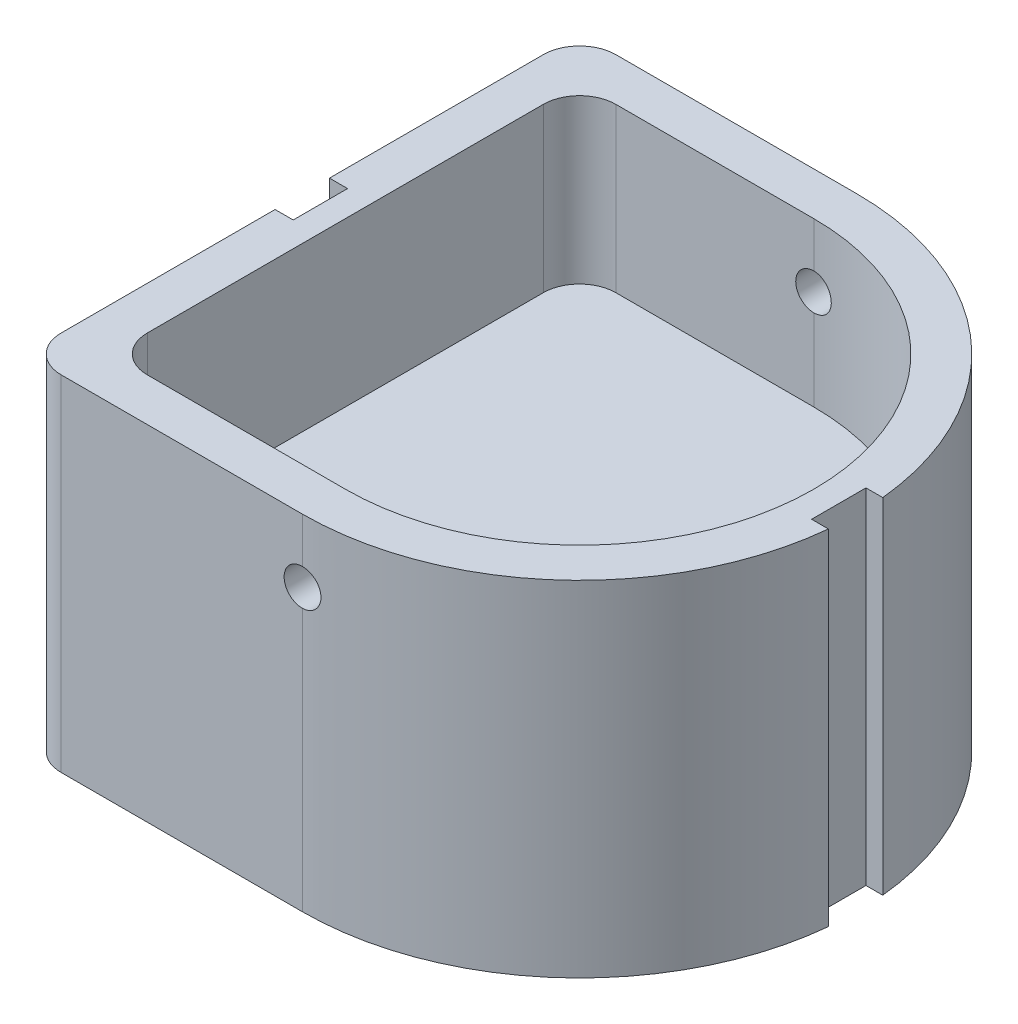
ISO-10303-21;
HEADER;
FILE_DESCRIPTION(('STEP AP214'),'2;1');
FILE_NAME('part.step','',(''),(''),'','','');
FILE_SCHEMA(('AUTOMOTIVE_DESIGN { 1 0 10303 214 1 1 1 1 }'));
ENDSEC;
DATA;
#1=APPLICATION_CONTEXT('core data for automotive mechanical design processes');
#2=APPLICATION_PROTOCOL_DEFINITION('international standard','automotive_design',2000,#1);
#3=PRODUCT_CONTEXT('',#1,'mechanical');
#4=PRODUCT('Part','Part','',(#3));
#5=PRODUCT_RELATED_PRODUCT_CATEGORY('part','',(#4));
#6=PRODUCT_DEFINITION_FORMATION('','',#4);
#7=PRODUCT_DEFINITION_CONTEXT('part definition',#1,'design');
#8=PRODUCT_DEFINITION('design','',#6,#7);
#9=PRODUCT_DEFINITION_SHAPE('','',#8);
#10=(LENGTH_UNIT() NAMED_UNIT(*) SI_UNIT(.MILLI.,.METRE.));
#11=(NAMED_UNIT(*) PLANE_ANGLE_UNIT() SI_UNIT($,.RADIAN.));
#12=(NAMED_UNIT(*) SI_UNIT($,.STERADIAN.) SOLID_ANGLE_UNIT());
#13=UNCERTAINTY_MEASURE_WITH_UNIT(LENGTH_MEASURE(1.E-05),#10,'distance_accuracy_value','');
#14=(GEOMETRIC_REPRESENTATION_CONTEXT(3) GLOBAL_UNCERTAINTY_ASSIGNED_CONTEXT((#13)) GLOBAL_UNIT_ASSIGNED_CONTEXT((#10,
#11,#12)) REPRESENTATION_CONTEXT('',''));
#15=CARTESIAN_POINT('',(0.,0.,0.));
#16=DIRECTION('',(0.,0.,1.));
#17=DIRECTION('',(1.,0.,0.));
#18=AXIS2_PLACEMENT_3D('',#15,#16,#17);
#19=CARTESIAN_POINT('',(0.,19.,0.));
#20=DIRECTION('',(0.,-1.,0.));
#21=DIRECTION('',(0.,0.,-1.));
#22=AXIS2_PLACEMENT_3D('',#19,#20,#21);
#23=CYLINDRICAL_SURFACE('',#22,15.3);
#24=DIRECTION('',(0.,-1.,0.));
#25=VECTOR('',#24,1.);
#26=CARTESIAN_POINT('',(15.2262930485394,19.,-1.5));
#27=LINE('',#26,#25);
#28=CARTESIAN_POINT('',(15.2262930485394,0.,-1.5));
#29=VERTEX_POINT('',#28);
#30=CARTESIAN_POINT('',(15.2262930485394,19.,-1.5));
#31=VERTEX_POINT('',#30);
#32=EDGE_CURVE('E201',#29,#31,#27,.F.);
#33=ORIENTED_EDGE('',*,*,#32,.F.);
#34=CARTESIAN_POINT('',(0.,0.,0.));
#35=DIRECTION('',(0.,1.,0.));
#36=DIRECTION('',(0.,0.,-1.));
#37=AXIS2_PLACEMENT_3D('',#34,#35,#36);
#38=CIRCLE('',#37,15.3);
#39=CARTESIAN_POINT('',(0.,0.,-15.3));
#40=VERTEX_POINT('',#39);
#41=EDGE_CURVE('E390',#29,#40,#38,.T.);
#42=ORIENTED_EDGE('',*,*,#41,.T.);
#43=DIRECTION('',(0.,-1.,0.));
#44=VECTOR('',#43,1.);
#45=CARTESIAN_POINT('',(0.,19.,-15.3));
#46=LINE('',#45,#44);
#47=CARTESIAN_POINT('',(0.,14.5,-15.3));
#48=VERTEX_POINT('',#47);
#49=EDGE_CURVE('E334',#48,#40,#46,.T.);
#50=ORIENTED_EDGE('',*,*,#49,.F.);
#51=CARTESIAN_POINT('',(0.,14.5,-15.3));
#52=CARTESIAN_POINT('',(0.0281021583670742,14.5000001511755,-15.3000004331714));
#53=CARTESIAN_POINT('',(0.056190824244706,14.5011853407923,-15.299922476909));
#54=CARTESIAN_POINT('',(0.112166585628104,14.5059133113102,-15.2996143787814));
#55=CARTESIAN_POINT('',(0.140053692278856,14.5094559608343,-15.2993842453967));
#56=CARTESIAN_POINT('',(0.223062277624624,14.5235856979367,-15.2984734784822));
#57=CARTESIAN_POINT('',(0.277626787633908,14.5376746714549,-15.2975724479204));
#58=CARTESIAN_POINT('',(0.383607446879149,14.5747953840197,-15.2952824253178));
#59=CARTESIAN_POINT('',(0.435022241174894,14.5978309408514,-15.2938932249842));
#60=CARTESIAN_POINT('',(0.533254512378253,14.6521861651708,-15.2907833328018));
#61=CARTESIAN_POINT('',(0.580072742016782,14.6835044731665,-15.2890626953663));
#62=CARTESIAN_POINT('',(0.667852919307626,14.7535874836872,-15.2854803357131));
#63=CARTESIAN_POINT('',(0.70880689408998,14.7923621590794,-15.2836184265874));
#64=CARTESIAN_POINT('',(0.783635713301431,14.8762419329914,-15.2799647250161));
#65=CARTESIAN_POINT('',(0.817509478705558,14.9213479946671,-15.2781729432917));
#66=CARTESIAN_POINT('',(0.877235510685562,15.0166541600984,-15.2748602846495));
#67=CARTESIAN_POINT('',(0.903080856631284,15.0668586095619,-15.2733396419363));
#68=CARTESIAN_POINT('',(0.945970870457561,15.1709027725641,-15.2707433810584));
#69=CARTESIAN_POINT('',(0.963016179042946,15.2247422211264,-15.2696677304962));
#70=CARTESIAN_POINT('',(0.987801129931908,15.3344496194499,-15.2680845087009));
#71=CARTESIAN_POINT('',(0.995553985924292,15.3903145721618,-15.2675761308881));
#72=CARTESIAN_POINT('',(1.00157479856964,15.5025564488219,-15.2671823686226));
#73=CARTESIAN_POINT('',(0.999842637353396,15.5589333791236,-15.267296991912));
#74=CARTESIAN_POINT('',(0.986953209945711,15.6705056509053,-15.2681355785337));
#75=CARTESIAN_POINT('',(0.975810529179628,15.72570268545,-15.2688585989012));
#76=CARTESIAN_POINT('',(0.944439025481191,15.8334409882378,-15.2708310139895));
#77=CARTESIAN_POINT('',(0.92421018538531,15.885982251464,-15.2720804097046));
#78=CARTESIAN_POINT('',(0.875223604343626,15.9869656498881,-15.2749658964771));
#79=CARTESIAN_POINT('',(0.846459078969083,16.0354044848322,-15.2766022949254));
#80=CARTESIAN_POINT('',(0.781223904881144,16.126769385159,-15.2800769767043));
#81=CARTESIAN_POINT('',(0.744753523586859,16.1696956417637,-15.2819152530279));
#82=CARTESIAN_POINT('',(0.665065746024241,16.2488986051923,-15.2855905271263));
#83=CARTESIAN_POINT('',(0.621836697561183,16.2851635884126,-15.2874275170843));
#84=CARTESIAN_POINT('',(0.529880753701886,16.3499348527185,-15.2908907314688));
#85=CARTESIAN_POINT('',(0.481152149991007,16.378438713549,-15.2925168900663));
#86=CARTESIAN_POINT('',(0.379566890433507,16.4268764218154,-15.29537553054));
#87=CARTESIAN_POINT('',(0.326707538452921,16.4468046157796,-15.296607752578));
#88=CARTESIAN_POINT('',(0.218423862323177,16.477469735802,-15.2985361724925));
#89=CARTESIAN_POINT('',(0.16300357452311,16.4882206383456,-15.2992331852984));
#90=CARTESIAN_POINT('',(0.089338828459952,16.4961632973265,-15.2997496759879));
#91=CARTESIAN_POINT('',(0.0714857571403937,16.4976028028236,-15.2998434958634));
#92=CARTESIAN_POINT('',(0.0357575642141534,16.4995198459381,-15.299968576698));
#93=CARTESIAN_POINT('',(0.0178825286194936,16.4999989789568,-15.299999941409));
#94=CARTESIAN_POINT('',(0.,16.5,-15.3));
#95=B_SPLINE_CURVE_WITH_KNOTS('',3,(#51,#52,#53,#54,#55,#56,#57,#58,#59,#60,#61,#62,#63,#64,#65,
#66,#67,#68,#69,#70,#71,#72,#73,#74,#75,#76,#77,#78,#79,#80,#81,#82,#83,#84,#85,#86,#87,#88,#89,
#90,#91,#92,#93,#94),.UNSPECIFIED.,.F.,.F.,(4,2,2,2,2,2,2,2,2,2,2,2,2,2,2,2,2,2,2,2,2,4),(0.,
0.0842545990631176,0.168504503166345,0.336720676348355,0.505008711609865,0.673269141986019,
0.841756205400082,1.0102689275758,1.17892650996202,1.34757181115356,1.51597701637973,
1.68438431436276,1.85253107478158,2.02067815282674,2.18895923903291,2.35723448627841,
2.52580311217739,2.69442424504445,2.86315637100516,3.03163106687056,3.08534653532916,
3.13897269574854),.UNSPECIFIED.);
#96=CARTESIAN_POINT('',(0.,16.5,-15.3));
#97=VERTEX_POINT('',#96);
#98=EDGE_CURVE('E286',#48,#97,#95,.T.);
#99=ORIENTED_EDGE('',*,*,#98,.T.);
#100=CARTESIAN_POINT('',(0.,19.,-15.3));
#101=VERTEX_POINT('',#100);
#102=EDGE_CURVE('E330',#101,#97,#46,.T.);
#103=ORIENTED_EDGE('',*,*,#102,.F.);
#104=CARTESIAN_POINT('',(0.,19.,0.));
#105=DIRECTION('',(0.,1.,0.));
#106=DIRECTION('',(0.,0.,-1.));
#107=AXIS2_PLACEMENT_3D('',#104,#105,#106);
#108=CIRCLE('',#107,15.3);
#109=EDGE_CURVE('E373',#31,#101,#108,.T.);
#110=ORIENTED_EDGE('',*,*,#109,.F.);
#111=EDGE_LOOP('',(#33,#42,#50,#99,#103,#110));
#112=FACE_BOUND('',#111,.T.);
#113=ADVANCED_FACE('F33',(#112),#23,.T.);
#114=DIRECTION('',(0.,-1.,0.));
#115=VECTOR('',#114,1.);
#116=CARTESIAN_POINT('',(15.2262930485394,19.,1.5));
#117=LINE('',#116,#115);
#118=CARTESIAN_POINT('',(15.2262930485394,19.,1.5));
#119=VERTEX_POINT('',#118);
#120=CARTESIAN_POINT('',(15.2262930485394,0.,1.5));
#121=VERTEX_POINT('',#120);
#122=EDGE_CURVE('E48',#119,#121,#117,.T.);
#123=ORIENTED_EDGE('',*,*,#122,.F.);
#124=CARTESIAN_POINT('',(0.,19.,15.3));
#125=VERTEX_POINT('',#124);
#126=EDGE_CURVE('E374',#125,#119,#108,.T.);
#127=ORIENTED_EDGE('',*,*,#126,.F.);
#128=DIRECTION('',(0.,-1.,0.));
#129=VECTOR('',#128,1.);
#130=CARTESIAN_POINT('',(0.,19.,15.3));
#131=LINE('',#130,#129);
#132=CARTESIAN_POINT('',(0.,16.5,15.3));
#133=VERTEX_POINT('',#132);
#134=EDGE_CURVE('E329',#125,#133,#131,.T.);
#135=ORIENTED_EDGE('',*,*,#134,.T.);
#136=CARTESIAN_POINT('',(0.,16.5,15.3));
#137=CARTESIAN_POINT('',(0.0281021583670762,16.4999998488245,15.3000004331714));
#138=CARTESIAN_POINT('',(0.0561908242447079,16.4988146592077,15.299922476909));
#139=CARTESIAN_POINT('',(0.112166585628106,16.4940866886899,15.2996143787814));
#140=CARTESIAN_POINT('',(0.140053692278858,16.4905440391657,15.2993842453967));
#141=CARTESIAN_POINT('',(0.223062277624626,16.4764143020633,15.2984734784822));
#142=CARTESIAN_POINT('',(0.27762678763391,16.4623253285451,15.2975724479204));
#143=CARTESIAN_POINT('',(0.383607446879151,16.4252046159803,15.2952824253178));
#144=CARTESIAN_POINT('',(0.435022241174895,16.4021690591486,15.2938932249842));
#145=CARTESIAN_POINT('',(0.533254512378254,16.3478138348292,15.2907833328018));
#146=CARTESIAN_POINT('',(0.580072742016783,16.3164955268335,15.2890626953663));
#147=CARTESIAN_POINT('',(0.667852919307626,16.2464125163128,15.2854803357131));
#148=CARTESIAN_POINT('',(0.708806894089981,16.2076378409206,15.2836184265874));
#149=CARTESIAN_POINT('',(0.783635713301432,16.1237580670086,15.2799647250161));
#150=CARTESIAN_POINT('',(0.817509478705559,16.0786520053329,15.2781729432917));
#151=CARTESIAN_POINT('',(0.877235510685564,15.9833458399016,15.2748602846495));
#152=CARTESIAN_POINT('',(0.903080856631286,15.9331413904381,15.2733396419363));
#153=CARTESIAN_POINT('',(0.945970870457562,15.8290972274359,15.2707433810584));
#154=CARTESIAN_POINT('',(0.963016179042947,15.7752577788736,15.2696677304962));
#155=CARTESIAN_POINT('',(0.987801129931908,15.6655503805501,15.2680845087009));
#156=CARTESIAN_POINT('',(0.995553985924292,15.6096854278382,15.2675761308881));
#157=CARTESIAN_POINT('',(1.00157479856964,15.4974435511781,15.2671823686226));
#158=CARTESIAN_POINT('',(0.999842637353396,15.4410666208764,15.267296991912));
#159=CARTESIAN_POINT('',(0.986953209945711,15.3294943490947,15.2681355785337));
#160=CARTESIAN_POINT('',(0.975810529179628,15.27429731455,15.2688585989012));
#161=CARTESIAN_POINT('',(0.944439025481191,15.1665590117622,15.2708310139895));
#162=CARTESIAN_POINT('',(0.92421018538531,15.114017748536,15.2720804097046));
#163=CARTESIAN_POINT('',(0.875223604343625,15.0130343501119,15.2749658964771));
#164=CARTESIAN_POINT('',(0.846459078969082,14.9645955151678,15.2766022949254));
#165=CARTESIAN_POINT('',(0.781223904881142,14.873230614841,15.2800769767043));
#166=CARTESIAN_POINT('',(0.744753523586857,14.8303043582363,15.2819152530279));
#167=CARTESIAN_POINT('',(0.66506574602424,14.7511013948077,15.2855905271263));
#168=CARTESIAN_POINT('',(0.621836697561182,14.7148364115874,15.2874275170843));
#169=CARTESIAN_POINT('',(0.529880753701886,14.6500651472815,15.2908907314688));
#170=CARTESIAN_POINT('',(0.481152149991007,14.621561286451,15.2925168900663));
#171=CARTESIAN_POINT('',(0.379566890433506,14.5731235781846,15.29537553054));
#172=CARTESIAN_POINT('',(0.32670753845292,14.5531953842204,15.296607752578));
#173=CARTESIAN_POINT('',(0.218423862323177,14.522530264198,15.2985361724925));
#174=CARTESIAN_POINT('',(0.16300357452311,14.5117793616544,15.2992331852984));
#175=CARTESIAN_POINT('',(0.089338828459952,14.5038367026735,15.2997496759879));
#176=CARTESIAN_POINT('',(0.071485757140394,14.5023971971764,15.2998434958634));
#177=CARTESIAN_POINT('',(0.0357575642141544,14.5004801540619,15.299968576698));
#178=CARTESIAN_POINT('',(0.0178825286194948,14.5000010210432,15.299999941409));
#179=CARTESIAN_POINT('',(0.,14.5,15.3));
#180=B_SPLINE_CURVE_WITH_KNOTS('',3,(#136,#137,#138,#139,#140,#141,#142,#143,#144,#145,#146,
#147,#148,#149,#150,#151,#152,#153,#154,#155,#156,#157,#158,#159,#160,#161,#162,#163,#164,#165,
#166,#167,#168,#169,#170,#171,#172,#173,#174,#175,#176,#177,#178,#179),.UNSPECIFIED.,.F.,.F.,(4,
2,2,2,2,2,2,2,2,2,2,2,2,2,2,2,2,2,2,2,2,4),(0.,0.0842545990631172,0.168504503166345,
0.336720676348354,0.505008711609864,0.673269141986017,0.841756205400081,1.0102689275758,
1.17892650996203,1.34757181115356,1.51597701637973,1.68438431436276,1.85253107478158,
2.02067815282674,2.18895923903291,2.35723448627841,2.52580311217739,2.69442424504445,
2.86315637100516,3.03163106687055,3.08534653532916,3.13897269574853),.UNSPECIFIED.);
#181=CARTESIAN_POINT('',(0.,14.5,15.3));
#182=VERTEX_POINT('',#181);
#183=EDGE_CURVE('E292',#133,#182,#180,.T.);
#184=ORIENTED_EDGE('',*,*,#183,.T.);
#185=CARTESIAN_POINT('',(0.,0.,15.3));
#186=VERTEX_POINT('',#185);
#187=EDGE_CURVE('E320',#182,#186,#131,.T.);
#188=ORIENTED_EDGE('',*,*,#187,.T.);
#189=EDGE_CURVE('E391',#186,#121,#38,.T.);
#190=ORIENTED_EDGE('',*,*,#189,.T.);
#191=EDGE_LOOP('',(#123,#127,#135,#184,#188,#190));
#192=FACE_BOUND('',#191,.T.);
#193=ADVANCED_FACE('F301',(#192),#23,.T.);
#194=CARTESIAN_POINT('',(-15.3,19.,-13.3));
#195=DIRECTION('',(1.,0.,0.));
#196=DIRECTION('',(0.,0.,-1.));
#197=AXIS2_PLACEMENT_3D('',#194,#195,#196);
#198=PLANE('',#197);
#199=DIRECTION('',(0.,-1.,0.));
#200=VECTOR('',#199,1.);
#201=CARTESIAN_POINT('',(-15.3,19.,1.5));
#202=LINE('',#201,#200);
#203=CARTESIAN_POINT('',(-15.3,19.,1.5));
#204=VERTEX_POINT('',#203);
#205=CARTESIAN_POINT('',(-15.3,0.,1.5));
#206=VERTEX_POINT('',#205);
#207=EDGE_CURVE('E223',#204,#206,#202,.T.);
#208=ORIENTED_EDGE('',*,*,#207,.T.);
#209=DIRECTION('',(0.,0.,1.));
#210=VECTOR('',#209,1.);
#211=CARTESIAN_POINT('',(-15.3,0.,-13.3));
#212=LINE('',#211,#210);
#213=CARTESIAN_POINT('',(-15.3,0.,13.3));
#214=VERTEX_POINT('',#213);
#215=EDGE_CURVE('E397',#206,#214,#212,.T.);
#216=ORIENTED_EDGE('',*,*,#215,.T.);
#217=DIRECTION('',(0.,-1.,0.));
#218=VECTOR('',#217,1.);
#219=CARTESIAN_POINT('',(-15.3,19.,13.3));
#220=LINE('',#219,#218);
#221=CARTESIAN_POINT('',(-15.3,19.,13.3));
#222=VERTEX_POINT('',#221);
#223=EDGE_CURVE('E384',#222,#214,#220,.T.);
#224=ORIENTED_EDGE('',*,*,#223,.F.);
#225=DIRECTION('',(0.,0.,1.));
#226=VECTOR('',#225,1.);
#227=CARTESIAN_POINT('',(-15.3,19.,-13.3));
#228=LINE('',#227,#226);
#229=EDGE_CURVE('E380',#204,#222,#228,.T.);
#230=ORIENTED_EDGE('',*,*,#229,.F.);
#231=EDGE_LOOP('',(#208,#216,#224,#230));
#232=FACE_BOUND('',#231,.T.);
#233=ADVANCED_FACE('F499',(#232),#198,.F.);
#234=DIRECTION('',(0.,-1.,0.));
#235=VECTOR('',#234,1.);
#236=CARTESIAN_POINT('',(-15.3,19.,-1.5));
#237=LINE('',#236,#235);
#238=CARTESIAN_POINT('',(-15.3,19.,-1.5));
#239=VERTEX_POINT('',#238);
#240=CARTESIAN_POINT('',(-15.3,0.,-1.5));
#241=VERTEX_POINT('',#240);
#242=EDGE_CURVE('E56',#239,#241,#237,.T.);
#243=ORIENTED_EDGE('',*,*,#242,.F.);
#244=CARTESIAN_POINT('',(-15.3,19.,-13.3));
#245=VERTEX_POINT('',#244);
#246=EDGE_CURVE('E381',#245,#239,#228,.T.);
#247=ORIENTED_EDGE('',*,*,#246,.F.);
#248=DIRECTION('',(0.,-1.,0.));
#249=VECTOR('',#248,1.);
#250=CARTESIAN_POINT('',(-15.3,19.,-13.3));
#251=LINE('',#250,#249);
#252=CARTESIAN_POINT('',(-15.3,0.,-13.3));
#253=VERTEX_POINT('',#252);
#254=EDGE_CURVE('E402',#245,#253,#251,.T.);
#255=ORIENTED_EDGE('',*,*,#254,.T.);
#256=EDGE_CURVE('E371',#253,#241,#212,.T.);
#257=ORIENTED_EDGE('',*,*,#256,.T.);
#258=EDGE_LOOP('',(#243,#247,#255,#257));
#259=FACE_BOUND('',#258,.T.);
#260=ADVANCED_FACE('F419',(#259),#198,.F.);
#261=CARTESIAN_POINT('',(-13.3,19.,13.3));
#262=DIRECTION('',(0.,-1.,0.));
#263=DIRECTION('',(0.,0.,-1.));
#264=AXIS2_PLACEMENT_3D('',#261,#262,#263);
#265=PLANE('',#264);
#266=DIRECTION('',(0.,0.,1.));
#267=VECTOR('',#266,1.);
#268=CARTESIAN_POINT('',(-12.925,19.,-10.925));
#269=LINE('',#268,#267);
#270=CARTESIAN_POINT('',(-12.925,19.,-10.925));
#271=VERTEX_POINT('',#270);
#272=CARTESIAN_POINT('',(-12.925,19.,10.925));
#273=VERTEX_POINT('',#272);
#274=EDGE_CURVE('E467',#271,#273,#269,.T.);
#275=ORIENTED_EDGE('',*,*,#274,.F.);
#276=CARTESIAN_POINT('',(-10.925,19.,-10.925));
#277=DIRECTION('',(0.,1.,0.));
#278=DIRECTION('',(0.,0.,-1.));
#279=AXIS2_PLACEMENT_3D('',#276,#277,#278);
#280=CIRCLE('',#279,2.);
#281=CARTESIAN_POINT('',(-10.925,19.,-12.925));
#282=VERTEX_POINT('',#281);
#283=EDGE_CURVE('E450',#282,#271,#280,.T.);
#284=ORIENTED_EDGE('',*,*,#283,.F.);
#285=DIRECTION('',(-1.,0.,0.));
#286=VECTOR('',#285,1.);
#287=CARTESIAN_POINT('',(-10.925,19.,-12.925));
#288=LINE('',#287,#286);
#289=CARTESIAN_POINT('',(0.,19.,-12.925));
#290=VERTEX_POINT('',#289);
#291=EDGE_CURVE('E445',#290,#282,#288,.T.);
#292=ORIENTED_EDGE('',*,*,#291,.F.);
#293=CARTESIAN_POINT('',(0.,19.,0.));
#294=DIRECTION('',(0.,1.,0.));
#295=DIRECTION('',(0.,0.,-1.));
#296=AXIS2_PLACEMENT_3D('',#293,#294,#295);
#297=CIRCLE('',#296,12.925);
#298=CARTESIAN_POINT('',(0.,19.,12.925));
#299=VERTEX_POINT('',#298);
#300=EDGE_CURVE('E441',#299,#290,#297,.T.);
#301=ORIENTED_EDGE('',*,*,#300,.F.);
#302=DIRECTION('',(1.,0.,0.));
#303=VECTOR('',#302,1.);
#304=CARTESIAN_POINT('',(-10.925,19.,12.925));
#305=LINE('',#304,#303);
#306=CARTESIAN_POINT('',(-10.925,19.,12.925));
#307=VERTEX_POINT('',#306);
#308=EDGE_CURVE('E446',#307,#299,#305,.T.);
#309=ORIENTED_EDGE('',*,*,#308,.F.);
#310=CARTESIAN_POINT('',(-10.925,19.,10.925));
#311=DIRECTION('',(0.,1.,0.));
#312=DIRECTION('',(0.,0.,-1.));
#313=AXIS2_PLACEMENT_3D('',#310,#311,#312);
#314=CIRCLE('',#313,2.);
#315=EDGE_CURVE('E470',#273,#307,#314,.T.);
#316=ORIENTED_EDGE('',*,*,#315,.F.);
#317=EDGE_LOOP('',(#275,#284,#292,#301,#309,#316));
#318=FACE_BOUND('',#317,.T.);
#319=DIRECTION('',(-1.,0.,0.));
#320=VECTOR('',#319,1.);
#321=CARTESIAN_POINT('',(14.3,19.,-1.5));
#322=LINE('',#321,#320);
#323=CARTESIAN_POINT('',(14.3,19.,-1.5));
#324=VERTEX_POINT('',#323);
#325=EDGE_CURVE('E195',#31,#324,#322,.T.);
#326=ORIENTED_EDGE('',*,*,#325,.F.);
#327=ORIENTED_EDGE('',*,*,#109,.T.);
#328=DIRECTION('',(-1.,0.,0.));
#329=VECTOR('',#328,1.);
#330=CARTESIAN_POINT('',(-13.3,19.,-15.3));
#331=LINE('',#330,#329);
#332=CARTESIAN_POINT('',(-13.3,19.,-15.3));
#333=VERTEX_POINT('',#332);
#334=EDGE_CURVE('E376',#101,#333,#331,.T.);
#335=ORIENTED_EDGE('',*,*,#334,.T.);
#336=CARTESIAN_POINT('',(-13.3,19.,-13.3));
#337=DIRECTION('',(0.,1.,0.));
#338=DIRECTION('',(0.,0.,-1.));
#339=AXIS2_PLACEMENT_3D('',#336,#337,#338);
#340=CIRCLE('',#339,2.);
#341=EDGE_CURVE('E378',#333,#245,#340,.T.);
#342=ORIENTED_EDGE('',*,*,#341,.T.);
#343=ORIENTED_EDGE('',*,*,#246,.T.);
#344=DIRECTION('',(-1.,0.,0.));
#345=VECTOR('',#344,1.);
#346=CARTESIAN_POINT('',(-14.3,19.,-1.5));
#347=LINE('',#346,#345);
#348=CARTESIAN_POINT('',(-14.3,19.,-1.5));
#349=VERTEX_POINT('',#348);
#350=EDGE_CURVE('E231',#349,#239,#347,.T.);
#351=ORIENTED_EDGE('',*,*,#350,.F.);
#352=DIRECTION('',(0.,0.,-1.));
#353=VECTOR('',#352,1.);
#354=CARTESIAN_POINT('',(-14.3,19.,1.5));
#355=LINE('',#354,#353);
#356=CARTESIAN_POINT('',(-14.3,19.,1.5));
#357=VERTEX_POINT('',#356);
#358=EDGE_CURVE('E228',#357,#349,#355,.T.);
#359=ORIENTED_EDGE('',*,*,#358,.F.);
#360=DIRECTION('',(1.,0.,0.));
#361=VECTOR('',#360,1.);
#362=CARTESIAN_POINT('',(-14.3,19.,1.5));
#363=LINE('',#362,#361);
#364=EDGE_CURVE('E226',#204,#357,#363,.T.);
#365=ORIENTED_EDGE('',*,*,#364,.F.);
#366=ORIENTED_EDGE('',*,*,#229,.T.);
#367=CARTESIAN_POINT('',(-13.3,19.,13.3));
#368=DIRECTION('',(0.,1.,0.));
#369=DIRECTION('',(0.,0.,-1.));
#370=AXIS2_PLACEMENT_3D('',#367,#368,#369);
#371=CIRCLE('',#370,2.);
#372=CARTESIAN_POINT('',(-13.3,19.,15.3));
#373=VERTEX_POINT('',#372);
#374=EDGE_CURVE('E367',#222,#373,#371,.T.);
#375=ORIENTED_EDGE('',*,*,#374,.T.);
#376=DIRECTION('',(1.,0.,0.));
#377=VECTOR('',#376,1.);
#378=CARTESIAN_POINT('',(-13.3,19.,15.3));
#379=LINE('',#378,#377);
#380=EDGE_CURVE('E370',#373,#125,#379,.T.);
#381=ORIENTED_EDGE('',*,*,#380,.T.);
#382=ORIENTED_EDGE('',*,*,#126,.T.);
#383=DIRECTION('',(1.,0.,0.));
#384=VECTOR('',#383,1.);
#385=CARTESIAN_POINT('',(14.3,19.,1.5));
#386=LINE('',#385,#384);
#387=CARTESIAN_POINT('',(14.3,19.,1.5));
#388=VERTEX_POINT('',#387);
#389=EDGE_CURVE('E218',#388,#119,#386,.T.);
#390=ORIENTED_EDGE('',*,*,#389,.F.);
#391=DIRECTION('',(0.,0.,1.));
#392=VECTOR('',#391,1.);
#393=CARTESIAN_POINT('',(14.3,19.,1.5));
#394=LINE('',#393,#392);
#395=EDGE_CURVE('E205',#324,#388,#394,.T.);
#396=ORIENTED_EDGE('',*,*,#395,.F.);
#397=EDGE_LOOP('',(#326,#327,#335,#342,#343,#351,#359,#365,#366,#375,#381,#382,#390,#396));
#398=FACE_BOUND('',#397,.T.);
#399=ADVANCED_FACE('F216',(#318,#398),#265,.F.);
#400=CARTESIAN_POINT('',(-13.3,0.,13.3));
#401=DIRECTION('',(0.,-1.,0.));
#402=DIRECTION('',(0.,0.,-1.));
#403=AXIS2_PLACEMENT_3D('',#400,#401,#402);
#404=PLANE('',#403);
#405=ORIENTED_EDGE('',*,*,#41,.F.);
#406=DIRECTION('',(-1.,0.,0.));
#407=VECTOR('',#406,1.);
#408=CARTESIAN_POINT('',(-13.3,0.,-1.5));
#409=LINE('',#408,#407);
#410=CARTESIAN_POINT('',(14.3,0.,-1.5));
#411=VERTEX_POINT('',#410);
#412=EDGE_CURVE('E11',#29,#411,#409,.T.);
#413=ORIENTED_EDGE('',*,*,#412,.T.);
#414=DIRECTION('',(0.,0.,1.));
#415=VECTOR('',#414,1.);
#416=CARTESIAN_POINT('',(14.3,0.,1.5));
#417=LINE('',#416,#415);
#418=CARTESIAN_POINT('',(14.3,0.,1.5));
#419=VERTEX_POINT('',#418);
#420=EDGE_CURVE('E212',#411,#419,#417,.T.);
#421=ORIENTED_EDGE('',*,*,#420,.T.);
#422=DIRECTION('',(1.,0.,0.));
#423=VECTOR('',#422,1.);
#424=CARTESIAN_POINT('',(14.3,0.,1.5));
#425=LINE('',#424,#423);
#426=EDGE_CURVE('E206',#419,#121,#425,.T.);
#427=ORIENTED_EDGE('',*,*,#426,.T.);
#428=ORIENTED_EDGE('',*,*,#189,.F.);
#429=DIRECTION('',(1.,0.,0.));
#430=VECTOR('',#429,1.);
#431=CARTESIAN_POINT('',(-13.3,0.,15.3));
#432=LINE('',#431,#430);
#433=CARTESIAN_POINT('',(-13.3,0.,15.3));
#434=VERTEX_POINT('',#433);
#435=EDGE_CURVE('E324',#434,#186,#432,.T.);
#436=ORIENTED_EDGE('',*,*,#435,.F.);
#437=CARTESIAN_POINT('',(-13.3,0.,13.3));
#438=DIRECTION('',(0.,1.,0.));
#439=DIRECTION('',(0.,0.,-1.));
#440=AXIS2_PLACEMENT_3D('',#437,#438,#439);
#441=CIRCLE('',#440,2.);
#442=EDGE_CURVE('E385',#214,#434,#441,.T.);
#443=ORIENTED_EDGE('',*,*,#442,.F.);
#444=ORIENTED_EDGE('',*,*,#215,.F.);
#445=DIRECTION('',(1.,0.,0.));
#446=VECTOR('',#445,1.);
#447=CARTESIAN_POINT('',(-14.3,0.,1.5));
#448=LINE('',#447,#446);
#449=CARTESIAN_POINT('',(-14.3,0.,1.5));
#450=VERTEX_POINT('',#449);
#451=EDGE_CURVE('E233',#206,#450,#448,.T.);
#452=ORIENTED_EDGE('',*,*,#451,.T.);
#453=DIRECTION('',(0.,0.,-1.));
#454=VECTOR('',#453,1.);
#455=CARTESIAN_POINT('',(-14.3,0.,1.5));
#456=LINE('',#455,#454);
#457=CARTESIAN_POINT('',(-14.3,0.,-1.5));
#458=VERTEX_POINT('',#457);
#459=EDGE_CURVE('E236',#450,#458,#456,.T.);
#460=ORIENTED_EDGE('',*,*,#459,.T.);
#461=DIRECTION('',(-1.,0.,0.));
#462=VECTOR('',#461,1.);
#463=CARTESIAN_POINT('',(-14.3,0.,-1.5));
#464=LINE('',#463,#462);
#465=EDGE_CURVE('E229',#458,#241,#464,.T.);
#466=ORIENTED_EDGE('',*,*,#465,.T.);
#467=ORIENTED_EDGE('',*,*,#256,.F.);
#468=CARTESIAN_POINT('',(-13.3,0.,-13.3));
#469=DIRECTION('',(0.,1.,0.));
#470=DIRECTION('',(0.,0.,-1.));
#471=AXIS2_PLACEMENT_3D('',#468,#469,#470);
#472=CIRCLE('',#471,2.);
#473=CARTESIAN_POINT('',(-13.3,0.,-15.3));
#474=VERTEX_POINT('',#473);
#475=EDGE_CURVE('E395',#474,#253,#472,.T.);
#476=ORIENTED_EDGE('',*,*,#475,.F.);
#477=DIRECTION('',(-1.,0.,0.));
#478=VECTOR('',#477,1.);
#479=CARTESIAN_POINT('',(-13.3,0.,-15.3));
#480=LINE('',#479,#478);
#481=EDGE_CURVE('E393',#40,#474,#480,.T.);
#482=ORIENTED_EDGE('',*,*,#481,.F.);
#483=EDGE_LOOP('',(#405,#413,#421,#427,#428,#436,#443,#444,#452,#460,#466,#467,#476,#482));
#484=FACE_BOUND('',#483,.T.);
#485=ADVANCED_FACE('F315',(#484),#404,.T.);
#486=CARTESIAN_POINT('',(-13.3,19.,13.3));
#487=DIRECTION('',(0.,-1.,0.));
#488=DIRECTION('',(0.,0.,-1.));
#489=AXIS2_PLACEMENT_3D('',#486,#487,#488);
#490=CYLINDRICAL_SURFACE('',#489,2.);
#491=ORIENTED_EDGE('',*,*,#442,.T.);
#492=DIRECTION('',(0.,-1.,0.));
#493=VECTOR('',#492,1.);
#494=CARTESIAN_POINT('',(-13.3,19.,15.3));
#495=LINE('',#494,#493);
#496=EDGE_CURVE('E332',#373,#434,#495,.T.);
#497=ORIENTED_EDGE('',*,*,#496,.F.);
#498=ORIENTED_EDGE('',*,*,#374,.F.);
#499=ORIENTED_EDGE('',*,*,#223,.T.);
#500=EDGE_LOOP('',(#491,#497,#498,#499));
#501=FACE_BOUND('',#500,.T.);
#502=ADVANCED_FACE('F35',(#501),#490,.T.);
#503=CARTESIAN_POINT('',(-13.3,19.,15.3));
#504=DIRECTION('',(0.,0.,-1.));
#505=DIRECTION('',(-1.,0.,0.));
#506=AXIS2_PLACEMENT_3D('',#503,#504,#505);
#507=PLANE('',#506);
#508=ORIENTED_EDGE('',*,*,#187,.F.);
#509=CARTESIAN_POINT('',(0.,15.5,15.3));
#510=DIRECTION('',(0.,0.,1.));
#511=DIRECTION('',(1.,0.,0.));
#512=AXIS2_PLACEMENT_3D('',#509,#510,#511);
#513=CIRCLE('',#512,1.);
#514=EDGE_CURVE('E249',#133,#182,#513,.T.);
#515=ORIENTED_EDGE('',*,*,#514,.F.);
#516=ORIENTED_EDGE('',*,*,#134,.F.);
#517=ORIENTED_EDGE('',*,*,#380,.F.);
#518=ORIENTED_EDGE('',*,*,#496,.T.);
#519=ORIENTED_EDGE('',*,*,#435,.T.);
#520=EDGE_LOOP('',(#508,#515,#516,#517,#518,#519));
#521=FACE_BOUND('',#520,.T.);
#522=ADVANCED_FACE('F305',(#521),#507,.F.);
#523=CARTESIAN_POINT('',(-13.3,19.,-15.3));
#524=DIRECTION('',(0.,0.,1.));
#525=DIRECTION('',(1.,0.,0.));
#526=AXIS2_PLACEMENT_3D('',#523,#524,#525);
#527=PLANE('',#526);
#528=ORIENTED_EDGE('',*,*,#102,.T.);
#529=CARTESIAN_POINT('',(0.,15.5,-15.3));
#530=DIRECTION('',(0.,0.,1.));
#531=DIRECTION('',(1.,0.,0.));
#532=AXIS2_PLACEMENT_3D('',#529,#530,#531);
#533=CIRCLE('',#532,1.);
#534=EDGE_CURVE('E251',#97,#48,#533,.T.);
#535=ORIENTED_EDGE('',*,*,#534,.T.);
#536=ORIENTED_EDGE('',*,*,#49,.T.);
#537=ORIENTED_EDGE('',*,*,#481,.T.);
#538=DIRECTION('',(0.,-1.,0.));
#539=VECTOR('',#538,1.);
#540=CARTESIAN_POINT('',(-13.3,19.,-15.3));
#541=LINE('',#540,#539);
#542=EDGE_CURVE('E404',#333,#474,#541,.T.);
#543=ORIENTED_EDGE('',*,*,#542,.F.);
#544=ORIENTED_EDGE('',*,*,#334,.F.);
#545=EDGE_LOOP('',(#528,#535,#536,#537,#543,#544));
#546=FACE_BOUND('',#545,.T.);
#547=ADVANCED_FACE('F303',(#546),#527,.F.);
#548=CARTESIAN_POINT('',(-13.3,19.,-13.3));
#549=DIRECTION('',(0.,-1.,0.));
#550=DIRECTION('',(0.,0.,-1.));
#551=AXIS2_PLACEMENT_3D('',#548,#549,#550);
#552=CYLINDRICAL_SURFACE('',#551,2.);
#553=ORIENTED_EDGE('',*,*,#475,.T.);
#554=ORIENTED_EDGE('',*,*,#254,.F.);
#555=ORIENTED_EDGE('',*,*,#341,.F.);
#556=ORIENTED_EDGE('',*,*,#542,.T.);
#557=EDGE_LOOP('',(#553,#554,#555,#556));
#558=FACE_BOUND('',#557,.T.);
#559=ADVANCED_FACE('F313',(#558),#552,.T.);
#560=CARTESIAN_POINT('',(-10.925,10.,-10.925));
#561=DIRECTION('',(0.,1.,0.));
#562=DIRECTION('',(0.,0.,1.));
#563=AXIS2_PLACEMENT_3D('',#560,#561,#562);
#564=CYLINDRICAL_SURFACE('',#563,2.);
#565=ORIENTED_EDGE('',*,*,#283,.T.);
#566=DIRECTION('',(0.,1.,0.));
#567=VECTOR('',#566,1.);
#568=CARTESIAN_POINT('',(-12.925,10.,-10.925));
#569=LINE('',#568,#567);
#570=CARTESIAN_POINT('',(-12.925,10.,-10.925));
#571=VERTEX_POINT('',#570);
#572=EDGE_CURVE('E363',#571,#271,#569,.T.);
#573=ORIENTED_EDGE('',*,*,#572,.F.);
#574=CARTESIAN_POINT('',(-10.925,10.,-10.925));
#575=DIRECTION('',(0.,1.,0.));
#576=DIRECTION('',(0.,0.,-1.));
#577=AXIS2_PLACEMENT_3D('',#574,#575,#576);
#578=CIRCLE('',#577,2.);
#579=CARTESIAN_POINT('',(-10.925,10.,-12.925));
#580=VERTEX_POINT('',#579);
#581=EDGE_CURVE('E451',#580,#571,#578,.T.);
#582=ORIENTED_EDGE('',*,*,#581,.F.);
#583=DIRECTION('',(0.,1.,0.));
#584=VECTOR('',#583,1.);
#585=CARTESIAN_POINT('',(-10.925,10.,-12.925));
#586=LINE('',#585,#584);
#587=EDGE_CURVE('E388',#580,#282,#586,.T.);
#588=ORIENTED_EDGE('',*,*,#587,.T.);
#589=EDGE_LOOP('',(#565,#573,#582,#588));
#590=FACE_BOUND('',#589,.T.);
#591=ADVANCED_FACE('F458',(#590),#564,.F.);
#592=CARTESIAN_POINT('',(-10.925,10.,-12.925));
#593=DIRECTION('',(0.,0.,-1.));
#594=DIRECTION('',(-1.,0.,0.));
#595=AXIS2_PLACEMENT_3D('',#592,#593,#594);
#596=PLANE('',#595);
#597=DIRECTION('',(0.,1.,0.));
#598=VECTOR('',#597,1.);
#599=CARTESIAN_POINT('',(0.,10.,-12.925));
#600=LINE('',#599,#598);
#601=CARTESIAN_POINT('',(0.,10.,-12.925));
#602=VERTEX_POINT('',#601);
#603=CARTESIAN_POINT('',(0.,14.5,-12.925));
#604=VERTEX_POINT('',#603);
#605=EDGE_CURVE('E355',#602,#604,#600,.T.);
#606=ORIENTED_EDGE('',*,*,#605,.T.);
#607=CARTESIAN_POINT('',(0.,15.5,-12.925));
#608=DIRECTION('',(0.,0.,-1.));
#609=DIRECTION('',(-1.,0.,0.));
#610=AXIS2_PLACEMENT_3D('',#607,#608,#609);
#611=CIRCLE('',#610,1.);
#612=CARTESIAN_POINT('',(0.,16.5,-12.925));
#613=VERTEX_POINT('',#612);
#614=EDGE_CURVE('E293',#604,#613,#611,.T.);
#615=ORIENTED_EDGE('',*,*,#614,.T.);
#616=EDGE_CURVE('E353',#613,#290,#600,.T.);
#617=ORIENTED_EDGE('',*,*,#616,.T.);
#618=ORIENTED_EDGE('',*,*,#291,.T.);
#619=ORIENTED_EDGE('',*,*,#587,.F.);
#620=DIRECTION('',(-1.,0.,0.));
#621=VECTOR('',#620,1.);
#622=CARTESIAN_POINT('',(-10.925,10.,-12.925));
#623=LINE('',#622,#621);
#624=EDGE_CURVE('E366',#602,#580,#623,.T.);
#625=ORIENTED_EDGE('',*,*,#624,.F.);
#626=EDGE_LOOP('',(#606,#615,#617,#618,#619,#625));
#627=FACE_BOUND('',#626,.T.);
#628=ADVANCED_FACE('F436',(#627),#596,.F.);
#629=CARTESIAN_POINT('',(0.,10.,0.));
#630=DIRECTION('',(0.,1.,0.));
#631=DIRECTION('',(0.,0.,1.));
#632=AXIS2_PLACEMENT_3D('',#629,#630,#631);
#633=CYLINDRICAL_SURFACE('',#632,12.925);
#634=ORIENTED_EDGE('',*,*,#616,.F.);
#635=CARTESIAN_POINT('',(0.,16.5,-12.925));
#636=CARTESIAN_POINT('',(0.0280894031159087,16.4999998630191,-12.9250005120285));
#637=CARTESIAN_POINT('',(0.0561653083717261,16.4988157346151,-12.9249083152756));
#638=CARTESIAN_POINT('',(0.112115406460813,16.4940920908807,-12.9245439342643));
#639=CARTESIAN_POINT('',(0.139989611067656,16.4905527141692,-12.9242717605986));
#640=CARTESIAN_POINT('',(0.222957473395579,16.4764365781678,-12.9231946365988));
#641=CARTESIAN_POINT('',(0.27749406917318,16.4623617126513,-12.9221290467211));
#642=CARTESIAN_POINT('',(0.383419253033411,16.4252806223129,-12.919420705338));
#643=CARTESIAN_POINT('',(0.434806533358664,16.4022707159113,-12.9177777159482));
#644=CARTESIAN_POINT('',(0.532989377393052,16.3479781451804,-12.9140993178811));
#645=CARTESIAN_POINT('',(0.579785634111542,16.3166967320671,-12.9120639685679));
#646=CARTESIAN_POINT('',(0.667554868155711,16.2466783620702,-12.9078245225699));
#647=CARTESIAN_POINT('',(0.7085167588572,16.2079275317866,-12.9056201165463));
#648=CARTESIAN_POINT('',(0.783367322813223,16.1240941973409,-12.9012933348561));
#649=CARTESIAN_POINT('',(0.817254917251253,16.079010729215,-12.8991709717409));
#650=CARTESIAN_POINT('',(0.877026068488666,15.9837272187638,-12.8952453223217));
#651=CARTESIAN_POINT('',(0.902899752300504,15.9335209656485,-12.8934424307608));
#652=CARTESIAN_POINT('',(0.945844288843977,15.8294636150396,-12.8903634457079));
#653=CARTESIAN_POINT('',(0.962915814104704,15.7756127963649,-12.8890873119703));
#654=CARTESIAN_POINT('',(0.987740700768419,15.6659063693094,-12.8872087593228));
#655=CARTESIAN_POINT('',(0.995512633777033,15.6100549867667,-12.8866049978301));
#656=CARTESIAN_POINT('',(1.00157512809244,15.4978360294966,-12.8861352615387));
#657=CARTESIAN_POINT('',(0.999865611961393,15.4414684505569,-12.8862692927657));
#658=CARTESIAN_POINT('',(0.987028765282312,15.329947324022,-12.8872588075584));
#659=CARTESIAN_POINT('',(0.97592186793124,15.274791408592,-12.8881127258231));
#660=CARTESIAN_POINT('',(0.944637309725585,15.1671293451367,-12.8904433324407));
#661=CARTESIAN_POINT('',(0.924459613595334,15.1146232074172,-12.8919200232155));
#662=CARTESIAN_POINT('',(0.875582805761294,15.0136845920347,-12.8953316194601));
#663=CARTESIAN_POINT('',(0.846874319861488,14.9652566713121,-12.8972670285238));
#664=CARTESIAN_POINT('',(0.781758946561462,14.8739015291719,-12.9013773871913));
#665=CARTESIAN_POINT('',(0.74535228155488,14.8309741489062,-12.9035523298744));
#666=CARTESIAN_POINT('',(0.66576516409626,14.7517229281415,-12.9079034126288));
#667=CARTESIAN_POINT('',(0.622568004441429,14.7154158650733,-12.9100795420998));
#668=CARTESIAN_POINT('',(0.530665862330827,14.6505548670553,-12.9141833059641));
#669=CARTESIAN_POINT('',(0.481959182053487,14.6220033313297,-12.9161108633633));
#670=CARTESIAN_POINT('',(0.380403641270504,14.5734661575148,-12.9195008066197));
#671=CARTESIAN_POINT('',(0.327551962542304,14.5534864082401,-12.9209628725071));
#672=CARTESIAN_POINT('',(0.219270497788505,14.5227191065877,-12.9232528292096));
#673=CARTESIAN_POINT('',(0.163844760875134,14.5119176006251,-12.9240816824967));
#674=CARTESIAN_POINT('',(0.090032423508655,14.5038966207766,-12.9246990558738));
#675=CARTESIAN_POINT('',(0.0720412605108023,14.5024346423821,-12.9248118458341));
#676=CARTESIAN_POINT('',(0.0360358699709693,14.5004876580531,-12.9249622216494));
#677=CARTESIAN_POINT('',(0.0180217307942248,14.5000010284907,-12.9249999324851));
#678=CARTESIAN_POINT('',(0.,14.5,-12.925));
#679=B_SPLINE_CURVE_WITH_KNOTS('',3,(#635,#636,#637,#638,#639,#640,#641,#642,#643,#644,#645,
#646,#647,#648,#649,#650,#651,#652,#653,#654,#655,#656,#657,#658,#659,#660,#661,#662,#663,#664,
#665,#666,#667,#668,#669,#670,#671,#672,#673,#674,#675,#676,#677,#678),.UNSPECIFIED.,.F.,.F.,(4,
2,2,2,2,2,2,2,2,2,2,2,2,2,2,2,2,2,2,2,2,4),(0.,0.0842163197514775,0.168427683358986,
0.336561080710307,0.504763829110333,0.672941148320622,0.841433896928736,1.00995232161532,
1.17867753955103,1.34738986412221,1.51576469903871,1.68414090912488,1.85215194845915,
2.0201636411816,2.18836064332913,2.35655278707659,2.5251654182215,2.69383015155639,
2.86261057267854,3.03113393728727,3.0852675345636,3.1393109425118),.UNSPECIFIED.);
#680=EDGE_CURVE('E262',#613,#604,#679,.T.);
#681=ORIENTED_EDGE('',*,*,#680,.T.);
#682=ORIENTED_EDGE('',*,*,#605,.F.);
#683=CARTESIAN_POINT('',(0.,10.,0.));
#684=DIRECTION('',(0.,1.,0.));
#685=DIRECTION('',(0.,0.,-1.));
#686=AXIS2_PLACEMENT_3D('',#683,#684,#685);
#687=CIRCLE('',#686,12.925);
#688=CARTESIAN_POINT('',(0.,10.,12.925));
#689=VERTEX_POINT('',#688);
#690=EDGE_CURVE('E351',#689,#602,#687,.T.);
#691=ORIENTED_EDGE('',*,*,#690,.F.);
#692=DIRECTION('',(0.,1.,0.));
#693=VECTOR('',#692,1.);
#694=CARTESIAN_POINT('',(0.,10.,12.925));
#695=LINE('',#694,#693);
#696=CARTESIAN_POINT('',(0.,14.5,12.925));
#697=VERTEX_POINT('',#696);
#698=EDGE_CURVE('E344',#689,#697,#695,.T.);
#699=ORIENTED_EDGE('',*,*,#698,.T.);
#700=CARTESIAN_POINT('',(0.,14.5,12.925));
#701=CARTESIAN_POINT('',(0.0280894031159072,14.5000001369809,12.9250005120285));
#702=CARTESIAN_POINT('',(0.0561653083717246,14.5011842653849,12.9249083152756));
#703=CARTESIAN_POINT('',(0.112115406460812,14.5059079091193,12.9245439342643));
#704=CARTESIAN_POINT('',(0.139989611067654,14.5094472858308,12.9242717605986));
#705=CARTESIAN_POINT('',(0.222957473395577,14.5235634218321,12.9231946365988));
#706=CARTESIAN_POINT('',(0.277494069173179,14.5376382873487,12.9221290467211));
#707=CARTESIAN_POINT('',(0.38341925303341,14.5747193776871,12.919420705338));
#708=CARTESIAN_POINT('',(0.434806533358662,14.5977292840887,12.9177777159482));
#709=CARTESIAN_POINT('',(0.53298937739305,14.6520218548196,12.9140993178811));
#710=CARTESIAN_POINT('',(0.579785634111541,14.6833032679329,12.9120639685679));
#711=CARTESIAN_POINT('',(0.667554868155709,14.7533216379298,12.9078245225699));
#712=CARTESIAN_POINT('',(0.708516758857199,14.7920724682134,12.9056201165463));
#713=CARTESIAN_POINT('',(0.783367322813221,14.8759058026591,12.9012933348561));
#714=CARTESIAN_POINT('',(0.817254917251251,14.920989270785,12.8991709717409));
#715=CARTESIAN_POINT('',(0.877026068488665,15.0162727812362,12.8952453223217));
#716=CARTESIAN_POINT('',(0.902899752300503,15.0664790343515,12.8934424307608));
#717=CARTESIAN_POINT('',(0.945844288843976,15.1705363849604,12.8903634457079));
#718=CARTESIAN_POINT('',(0.962915814104704,15.2243872036351,12.8890873119703));
#719=CARTESIAN_POINT('',(0.987740700768418,15.3340936306906,12.8872087593228));
#720=CARTESIAN_POINT('',(0.995512633777033,15.3899450132332,12.8866049978301));
#721=CARTESIAN_POINT('',(1.00157512809244,15.5021639705034,12.8861352615387));
#722=CARTESIAN_POINT('',(0.999865611961393,15.5585315494431,12.8862692927657));
#723=CARTESIAN_POINT('',(0.987028765282312,15.670052675978,12.8872588075584));
#724=CARTESIAN_POINT('',(0.97592186793124,15.725208591408,12.8881127258231));
#725=CARTESIAN_POINT('',(0.944637309725585,15.8328706548633,12.8904433324407));
#726=CARTESIAN_POINT('',(0.924459613595334,15.8853767925828,12.8919200232155));
#727=CARTESIAN_POINT('',(0.875582805761295,15.9863154079653,12.8953316194601));
#728=CARTESIAN_POINT('',(0.84687431986149,16.0347433286879,12.8972670285238));
#729=CARTESIAN_POINT('',(0.781758946561464,16.1260984708281,12.9013773871913));
#730=CARTESIAN_POINT('',(0.745352281554881,16.1690258510938,12.9035523298744));
#731=CARTESIAN_POINT('',(0.665765164096259,16.2482770718585,12.9079034126288));
#732=CARTESIAN_POINT('',(0.622568004441428,16.2845841349267,12.9100795420998));
#733=CARTESIAN_POINT('',(0.530665862330827,16.3494451329447,12.9141833059641));
#734=CARTESIAN_POINT('',(0.481959182053486,16.3779966686703,12.9161108633633));
#735=CARTESIAN_POINT('',(0.380403641270503,16.4265338424852,12.9195008066197));
#736=CARTESIAN_POINT('',(0.327551962542303,16.4465135917599,12.9209628725071));
#737=CARTESIAN_POINT('',(0.219270497788505,16.4772808934123,12.9232528292096));
#738=CARTESIAN_POINT('',(0.163844760875135,16.4880823993749,12.9240816824967));
#739=CARTESIAN_POINT('',(0.090032423508656,16.4961033792234,12.9246990558738));
#740=CARTESIAN_POINT('',(0.0720412605108029,16.4975653576179,12.9248118458341));
#741=CARTESIAN_POINT('',(0.0360358699709689,16.4995123419469,12.9249622216494));
#742=CARTESIAN_POINT('',(0.0180217307942237,16.4999989715093,12.9249999324851));
#743=CARTESIAN_POINT('',(0.,16.5,12.925));
#744=B_SPLINE_CURVE_WITH_KNOTS('',3,(#700,#701,#702,#703,#704,#705,#706,#707,#708,#709,#710,
#711,#712,#713,#714,#715,#716,#717,#718,#719,#720,#721,#722,#723,#724,#725,#726,#727,#728,#729,
#730,#731,#732,#733,#734,#735,#736,#737,#738,#739,#740,#741,#742,#743),.UNSPECIFIED.,.F.,.F.,(4,
2,2,2,2,2,2,2,2,2,2,2,2,2,2,2,2,2,2,2,2,4),(0.,0.0842163197514776,0.168427683358986,
0.336561080710307,0.504763829110332,0.672941148320622,0.841433896928734,1.00995232161532,
1.17867753955103,1.34738986412221,1.51576469903871,1.68414090912488,1.85215194845915,
2.0201636411816,2.18836064332913,2.35655278707659,2.5251654182215,2.69383015155639,
2.86261057267854,3.03113393728727,3.0852675345636,3.13931094251181),.UNSPECIFIED.);
#745=CARTESIAN_POINT('',(0.,16.5,12.925));
#746=VERTEX_POINT('',#745);
#747=EDGE_CURVE('E254',#697,#746,#744,.T.);
#748=ORIENTED_EDGE('',*,*,#747,.T.);
#749=EDGE_CURVE('E347',#746,#299,#695,.T.);
#750=ORIENTED_EDGE('',*,*,#749,.T.);
#751=ORIENTED_EDGE('',*,*,#300,.T.);
#752=EDGE_LOOP('',(#634,#681,#682,#691,#699,#748,#750,#751));
#753=FACE_BOUND('',#752,.T.);
#754=ADVANCED_FACE('F267',(#753),#633,.F.);
#755=CARTESIAN_POINT('',(-10.925,10.,12.925));
#756=DIRECTION('',(0.,0.,1.));
#757=DIRECTION('',(1.,0.,0.));
#758=AXIS2_PLACEMENT_3D('',#755,#756,#757);
#759=PLANE('',#758);
#760=ORIENTED_EDGE('',*,*,#749,.F.);
#761=CARTESIAN_POINT('',(0.,15.5,12.925));
#762=DIRECTION('',(0.,0.,1.));
#763=DIRECTION('',(1.,0.,0.));
#764=AXIS2_PLACEMENT_3D('',#761,#762,#763);
#765=CIRCLE('',#764,1.);
#766=EDGE_CURVE('E41',#746,#697,#765,.T.);
#767=ORIENTED_EDGE('',*,*,#766,.T.);
#768=ORIENTED_EDGE('',*,*,#698,.F.);
#769=DIRECTION('',(1.,0.,0.));
#770=VECTOR('',#769,1.);
#771=CARTESIAN_POINT('',(-10.925,10.,12.925));
#772=LINE('',#771,#770);
#773=CARTESIAN_POINT('',(-10.925,10.,12.925));
#774=VERTEX_POINT('',#773);
#775=EDGE_CURVE('E462',#774,#689,#772,.T.);
#776=ORIENTED_EDGE('',*,*,#775,.F.);
#777=DIRECTION('',(0.,1.,0.));
#778=VECTOR('',#777,1.);
#779=CARTESIAN_POINT('',(-10.925,10.,12.925));
#780=LINE('',#779,#778);
#781=EDGE_CURVE('E357',#774,#307,#780,.T.);
#782=ORIENTED_EDGE('',*,*,#781,.T.);
#783=ORIENTED_EDGE('',*,*,#308,.T.);
#784=EDGE_LOOP('',(#760,#767,#768,#776,#782,#783));
#785=FACE_BOUND('',#784,.T.);
#786=ADVANCED_FACE('F342',(#785),#759,.F.);
#787=CARTESIAN_POINT('',(-10.925,10.,10.925));
#788=DIRECTION('',(0.,1.,0.));
#789=DIRECTION('',(0.,0.,1.));
#790=AXIS2_PLACEMENT_3D('',#787,#788,#789);
#791=CYLINDRICAL_SURFACE('',#790,2.);
#792=ORIENTED_EDGE('',*,*,#315,.T.);
#793=ORIENTED_EDGE('',*,*,#781,.F.);
#794=CARTESIAN_POINT('',(-10.925,10.,10.925));
#795=DIRECTION('',(0.,1.,0.));
#796=DIRECTION('',(0.,0.,-1.));
#797=AXIS2_PLACEMENT_3D('',#794,#795,#796);
#798=CIRCLE('',#797,2.);
#799=CARTESIAN_POINT('',(-12.925,10.,10.925));
#800=VERTEX_POINT('',#799);
#801=EDGE_CURVE('E477',#800,#774,#798,.T.);
#802=ORIENTED_EDGE('',*,*,#801,.F.);
#803=DIRECTION('',(0.,1.,0.));
#804=VECTOR('',#803,1.);
#805=CARTESIAN_POINT('',(-12.925,10.,10.925));
#806=LINE('',#805,#804);
#807=EDGE_CURVE('E361',#800,#273,#806,.T.);
#808=ORIENTED_EDGE('',*,*,#807,.T.);
#809=EDGE_LOOP('',(#792,#793,#802,#808));
#810=FACE_BOUND('',#809,.T.);
#811=ADVANCED_FACE('F474',(#810),#791,.F.);
#812=CARTESIAN_POINT('',(-12.925,10.,-10.925));
#813=DIRECTION('',(-1.,0.,0.));
#814=DIRECTION('',(0.,0.,1.));
#815=AXIS2_PLACEMENT_3D('',#812,#813,#814);
#816=PLANE('',#815);
#817=ORIENTED_EDGE('',*,*,#274,.T.);
#818=ORIENTED_EDGE('',*,*,#807,.F.);
#819=DIRECTION('',(0.,0.,1.));
#820=VECTOR('',#819,1.);
#821=CARTESIAN_POINT('',(-12.925,10.,-10.925));
#822=LINE('',#821,#820);
#823=EDGE_CURVE('E454',#571,#800,#822,.T.);
#824=ORIENTED_EDGE('',*,*,#823,.F.);
#825=ORIENTED_EDGE('',*,*,#572,.T.);
#826=EDGE_LOOP('',(#817,#818,#824,#825));
#827=FACE_BOUND('',#826,.T.);
#828=ADVANCED_FACE('F481',(#827),#816,.F.);
#829=CARTESIAN_POINT('',(-10.925,10.,-10.925));
#830=DIRECTION('',(0.,-1.,0.));
#831=DIRECTION('',(0.,0.,-1.));
#832=AXIS2_PLACEMENT_3D('',#829,#830,#831);
#833=PLANE('',#832);
#834=ORIENTED_EDGE('',*,*,#581,.T.);
#835=ORIENTED_EDGE('',*,*,#823,.T.);
#836=ORIENTED_EDGE('',*,*,#801,.T.);
#837=ORIENTED_EDGE('',*,*,#775,.T.);
#838=ORIENTED_EDGE('',*,*,#690,.T.);
#839=ORIENTED_EDGE('',*,*,#624,.T.);
#840=EDGE_LOOP('',(#834,#835,#836,#837,#838,#839));
#841=FACE_BOUND('',#840,.T.);
#842=ADVANCED_FACE('F277',(#841),#833,.F.);
#843=CARTESIAN_POINT('',(0.,15.5,-15.3));
#844=DIRECTION('',(0.,0.,1.));
#845=DIRECTION('',(1.,0.,0.));
#846=AXIS2_PLACEMENT_3D('',#843,#844,#845);
#847=CYLINDRICAL_SURFACE('',#846,1.);
#848=ORIENTED_EDGE('',*,*,#766,.F.);
#849=ORIENTED_EDGE('',*,*,#747,.F.);
#850=EDGE_LOOP('',(#848,#849));
#851=FACE_BOUND('',#850,.T.);
#852=ORIENTED_EDGE('',*,*,#514,.T.);
#853=ORIENTED_EDGE('',*,*,#183,.F.);
#854=EDGE_LOOP('',(#852,#853));
#855=FACE_BOUND('',#854,.T.);
#856=ADVANCED_FACE('F271',(#851,#855),#847,.F.);
#857=ORIENTED_EDGE('',*,*,#680,.F.);
#858=ORIENTED_EDGE('',*,*,#614,.F.);
#859=EDGE_LOOP('',(#857,#858));
#860=FACE_BOUND('',#859,.T.);
#861=ORIENTED_EDGE('',*,*,#534,.F.);
#862=ORIENTED_EDGE('',*,*,#98,.F.);
#863=EDGE_LOOP('',(#861,#862));
#864=FACE_BOUND('',#863,.T.);
#865=ADVANCED_FACE('F276',(#860,#864),#847,.F.);
#866=CARTESIAN_POINT('',(-14.3,19.,1.5));
#867=DIRECTION('',(0.,0.,-1.));
#868=DIRECTION('',(-1.,0.,0.));
#869=AXIS2_PLACEMENT_3D('',#866,#867,#868);
#870=PLANE('',#869);
#871=ORIENTED_EDGE('',*,*,#451,.F.);
#872=ORIENTED_EDGE('',*,*,#207,.F.);
#873=ORIENTED_EDGE('',*,*,#364,.T.);
#874=DIRECTION('',(0.,-1.,0.));
#875=VECTOR('',#874,1.);
#876=CARTESIAN_POINT('',(-14.3,19.,1.5));
#877=LINE('',#876,#875);
#878=EDGE_CURVE('E243',#357,#450,#877,.T.);
#879=ORIENTED_EDGE('',*,*,#878,.T.);
#880=EDGE_LOOP('',(#871,#872,#873,#879));
#881=FACE_BOUND('',#880,.T.);
#882=ADVANCED_FACE('F279',(#881),#870,.T.);
#883=CARTESIAN_POINT('',(-14.3,19.,1.5));
#884=DIRECTION('',(-1.,0.,0.));
#885=DIRECTION('',(0.,0.,1.));
#886=AXIS2_PLACEMENT_3D('',#883,#884,#885);
#887=PLANE('',#886);
#888=ORIENTED_EDGE('',*,*,#459,.F.);
#889=ORIENTED_EDGE('',*,*,#878,.F.);
#890=ORIENTED_EDGE('',*,*,#358,.T.);
#891=DIRECTION('',(0.,-1.,0.));
#892=VECTOR('',#891,1.);
#893=CARTESIAN_POINT('',(-14.3,19.,-1.5));
#894=LINE('',#893,#892);
#895=EDGE_CURVE('E241',#349,#458,#894,.T.);
#896=ORIENTED_EDGE('',*,*,#895,.T.);
#897=EDGE_LOOP('',(#888,#889,#890,#896));
#898=FACE_BOUND('',#897,.T.);
#899=ADVANCED_FACE('F430',(#898),#887,.T.);
#900=CARTESIAN_POINT('',(-14.3,19.,-1.5));
#901=DIRECTION('',(0.,0.,1.));
#902=DIRECTION('',(1.,0.,0.));
#903=AXIS2_PLACEMENT_3D('',#900,#901,#902);
#904=PLANE('',#903);
#905=ORIENTED_EDGE('',*,*,#465,.F.);
#906=ORIENTED_EDGE('',*,*,#895,.F.);
#907=ORIENTED_EDGE('',*,*,#350,.T.);
#908=ORIENTED_EDGE('',*,*,#242,.T.);
#909=EDGE_LOOP('',(#905,#906,#907,#908));
#910=FACE_BOUND('',#909,.T.);
#911=ADVANCED_FACE('F625',(#910),#904,.T.);
#912=CARTESIAN_POINT('',(14.3,19.,-1.5));
#913=DIRECTION('',(0.,0.,1.));
#914=DIRECTION('',(1.,0.,0.));
#915=AXIS2_PLACEMENT_3D('',#912,#913,#914);
#916=PLANE('',#915);
#917=ORIENTED_EDGE('',*,*,#32,.T.);
#918=ORIENTED_EDGE('',*,*,#325,.T.);
#919=DIRECTION('',(0.,-1.,0.));
#920=VECTOR('',#919,1.);
#921=CARTESIAN_POINT('',(14.3,19.,-1.5));
#922=LINE('',#921,#920);
#923=EDGE_CURVE('E198',#324,#411,#922,.T.);
#924=ORIENTED_EDGE('',*,*,#923,.T.);
#925=ORIENTED_EDGE('',*,*,#412,.F.);
#926=EDGE_LOOP('',(#917,#918,#924,#925));
#927=FACE_BOUND('',#926,.T.);
#928=ADVANCED_FACE('F197',(#927),#916,.T.);
#929=CARTESIAN_POINT('',(14.3,19.,1.5));
#930=DIRECTION('',(0.,0.,-1.));
#931=DIRECTION('',(-1.,0.,0.));
#932=AXIS2_PLACEMENT_3D('',#929,#930,#931);
#933=PLANE('',#932);
#934=ORIENTED_EDGE('',*,*,#122,.T.);
#935=ORIENTED_EDGE('',*,*,#426,.F.);
#936=DIRECTION('',(0.,-1.,0.));
#937=VECTOR('',#936,1.);
#938=CARTESIAN_POINT('',(14.3,19.,1.5));
#939=LINE('',#938,#937);
#940=EDGE_CURVE('E213',#388,#419,#939,.T.);
#941=ORIENTED_EDGE('',*,*,#940,.F.);
#942=ORIENTED_EDGE('',*,*,#389,.T.);
#943=EDGE_LOOP('',(#934,#935,#941,#942));
#944=FACE_BOUND('',#943,.T.);
#945=ADVANCED_FACE('F640',(#944),#933,.T.);
#946=CARTESIAN_POINT('',(14.3,19.,1.5));
#947=DIRECTION('',(1.,0.,0.));
#948=DIRECTION('',(0.,0.,-1.));
#949=AXIS2_PLACEMENT_3D('',#946,#947,#948);
#950=PLANE('',#949);
#951=ORIENTED_EDGE('',*,*,#420,.F.);
#952=ORIENTED_EDGE('',*,*,#923,.F.);
#953=ORIENTED_EDGE('',*,*,#395,.T.);
#954=ORIENTED_EDGE('',*,*,#940,.T.);
#955=EDGE_LOOP('',(#951,#952,#953,#954));
#956=FACE_BOUND('',#955,.T.);
#957=ADVANCED_FACE('F209',(#956),#950,.T.);
#958=CLOSED_SHELL('',(#113,#193,#233,#260,#399,#485,#502,#522,#547,#559,#591,#628,#754,#786,
#811,#828,#842,#856,#865,#882,#899,#911,#928,#945,#957));
#959=MANIFOLD_SOLID_BREP('B2',#958);
#960=ADVANCED_BREP_SHAPE_REPRESENTATION('',(#18,#959),#14);
#961=SHAPE_DEFINITION_REPRESENTATION(#9,#960);
ENDSEC;
END-ISO-10303-21;
